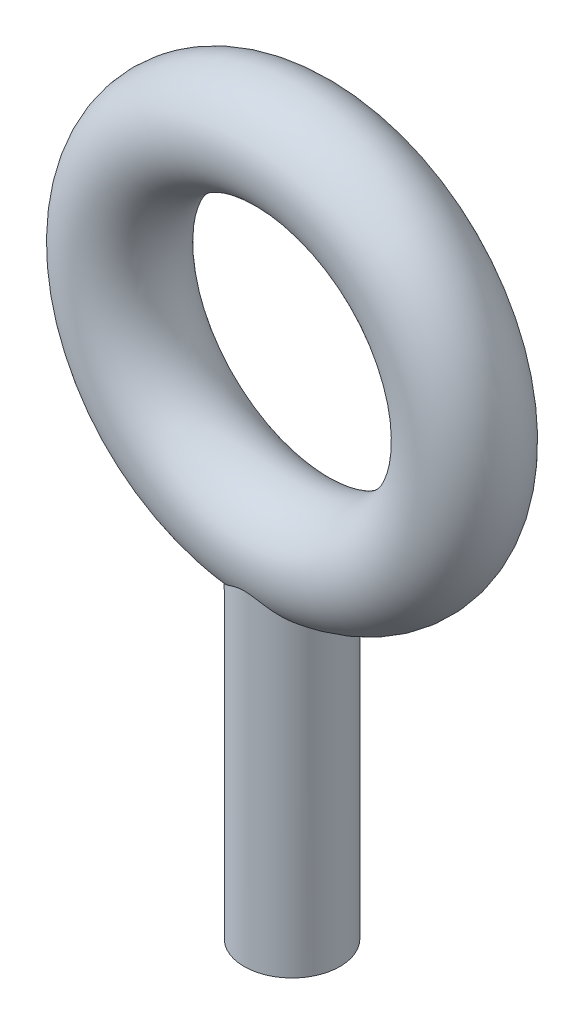
ISO-10303-21;
HEADER;
FILE_DESCRIPTION(('STEP AP214'),'2;1');
FILE_NAME('part.step','',(''),(''),'','','');
FILE_SCHEMA(('AUTOMOTIVE_DESIGN { 1 0 10303 214 1 1 1 1 }'));
ENDSEC;
DATA;
#1=APPLICATION_CONTEXT('core data for automotive mechanical design processes');
#2=APPLICATION_PROTOCOL_DEFINITION('international standard','automotive_design',2000,#1);
#3=PRODUCT_CONTEXT('',#1,'mechanical');
#4=PRODUCT('Part','Part','',(#3));
#5=PRODUCT_RELATED_PRODUCT_CATEGORY('part','',(#4));
#6=PRODUCT_DEFINITION_FORMATION('','',#4);
#7=PRODUCT_DEFINITION_CONTEXT('part definition',#1,'design');
#8=PRODUCT_DEFINITION('design','',#6,#7);
#9=PRODUCT_DEFINITION_SHAPE('','',#8);
#10=(LENGTH_UNIT() NAMED_UNIT(*) SI_UNIT(.MILLI.,.METRE.));
#11=(NAMED_UNIT(*) PLANE_ANGLE_UNIT() SI_UNIT($,.RADIAN.));
#12=(NAMED_UNIT(*) SI_UNIT($,.STERADIAN.) SOLID_ANGLE_UNIT());
#13=UNCERTAINTY_MEASURE_WITH_UNIT(LENGTH_MEASURE(1.E-05),#10,'distance_accuracy_value','');
#14=(GEOMETRIC_REPRESENTATION_CONTEXT(3) GLOBAL_UNCERTAINTY_ASSIGNED_CONTEXT((#13)) GLOBAL_UNIT_ASSIGNED_CONTEXT((#10,
#11,#12)) REPRESENTATION_CONTEXT('',''));
#15=CARTESIAN_POINT('',(0.,0.,0.));
#16=DIRECTION('',(0.,0.,1.));
#17=DIRECTION('',(1.,0.,0.));
#18=AXIS2_PLACEMENT_3D('',#15,#16,#17);
#19=CARTESIAN_POINT('',(0.,0.,0.));
#20=DIRECTION('',(0.,0.,1.));
#21=DIRECTION('',(1.,0.,0.));
#22=AXIS2_PLACEMENT_3D('',#19,#20,#21);
#23=TOROIDAL_SURFACE('',#22,15.875,4.7625);
#24=CARTESIAN_POINT('',(-3.18334869011785,-19.2659447342969,-3.05664304092332));
#25=CARTESIAN_POINT('',(-3.08520725549984,-19.195456140125,-3.15885374831986));
#26=CARTESIAN_POINT('',(-2.98300369281875,-19.1224371757501,-3.25544272208659));
#27=CARTESIAN_POINT('',(-2.77146320632803,-18.9727391863984,-3.43733046760139));
#28=CARTESIAN_POINT('',(-2.66212390909063,-18.8960589459383,-3.52262545397198));
#29=CARTESIAN_POINT('',(-2.43667603383207,-18.7404029703912,-3.68218832160037));
#30=CARTESIAN_POINT('',(-2.32055120131328,-18.6614219713128,-3.7564280750047));
#31=CARTESIAN_POINT('',(-2.08206036337605,-18.5033531147404,-3.89367739228447));
#32=CARTESIAN_POINT('',(-1.9596978329449,-18.4242653401298,-3.95669312293485));
#33=CARTESIAN_POINT('',(-1.69164280901768,-18.2582303100651,-4.07917393133311));
#34=CARTESIAN_POINT('',(-1.54500313693706,-18.1716241098012,-4.13707159067725));
#35=CARTESIAN_POINT('',(-1.3175015779446,-18.0490422142643,-4.21275642069983));
#36=CARTESIAN_POINT('',(-1.24044386447811,-18.0094175677955,-4.23611712501251));
#37=CARTESIAN_POINT('',(-1.0834785691227,-17.9339222411472,-4.27895696584173));
#38=CARTESIAN_POINT('',(-1.00357199164271,-17.8980502551219,-4.29843745473804));
#39=CARTESIAN_POINT('',(-0.811787080465899,-17.8200067314168,-4.33941180720683));
#40=CARTESIAN_POINT('',(-0.698579587280735,-17.7800812621989,-4.35918904782819));
#41=CARTESIAN_POINT('',(-0.466840539080351,-17.7159914683654,-4.39003370437951));
#42=CARTESIAN_POINT('',(-0.348330864188748,-17.6917677930023,-4.4011339513975));
#43=CARTESIAN_POINT('',(-0.106637602209662,-17.6643936227832,-4.41363242324062));
#44=CARTESIAN_POINT('',(0.0165862474403797,-17.6615149031419,-4.41490553210364));
#45=CARTESIAN_POINT('',(0.261219200099468,-17.6784512971815,-4.40722157315114));
#46=CARTESIAN_POINT('',(0.382624281920378,-17.6983108119746,-4.3982444898063));
#47=CARTESIAN_POINT('',(0.654595187868296,-17.7638911459752,-4.3671729736333));
#48=CARTESIAN_POINT('',(0.803296300592718,-17.815479761221,-4.34200839752675));
#49=CARTESIAN_POINT('',(1.09130536567191,-17.9350366742265,-4.27875654110573));
#50=CARTESIAN_POINT('',(1.23056385592844,-18.0030837966793,-4.2406067011385));
#51=CARTESIAN_POINT('',(1.49660175943668,-18.1448471669807,-4.15401619893279));
#52=CARTESIAN_POINT('',(1.62363706716366,-18.2183146455022,-4.10594095530367));
#53=CARTESIAN_POINT('',(1.87128267319161,-18.3684373239188,-3.99915856679065));
#54=CARTESIAN_POINT('',(1.9918881532934,-18.4450948397626,-3.9404435900039));
#55=CARTESIAN_POINT('',(2.22710855638734,-18.5988193834602,-3.81243774597225));
#56=CARTESIAN_POINT('',(2.34172244454083,-18.675886479539,-3.74314505984529));
#57=CARTESIAN_POINT('',(2.5648721320644,-18.8284938507638,-3.59391374623377));
#58=CARTESIAN_POINT('',(2.67340840037861,-18.9040342434207,-3.51397594173002));
#59=CARTESIAN_POINT('',(2.88767858462888,-19.0547097424052,-3.34032464954087));
#60=CARTESIAN_POINT('',(2.99317625659172,-19.1297352735674,-3.24622288396334));
#61=CARTESIAN_POINT('',(3.19627123989967,-19.2750753875729,-3.04645873335221));
#62=CARTESIAN_POINT('',(3.29386695318647,-19.3453890170084,-2.94079401998756));
#63=CARTESIAN_POINT('',(3.47968650965536,-19.4797353231338,-2.71836456295715));
#64=CARTESIAN_POINT('',(3.56793279470794,-19.5437830105596,-2.60162773563995));
#65=CARTESIAN_POINT('',(3.73384835747882,-19.6644171619128,-2.3573131073301));
#66=CARTESIAN_POINT('',(3.8115234347431,-19.7210077164056,-2.22974131348748));
#67=CARTESIAN_POINT('',(3.93188270899008,-19.8087633070891,-2.00689192183502));
#68=CARTESIAN_POINT('',(3.97782790857204,-19.8422827222768,-1.91428349817974));
#69=CARTESIAN_POINT('',(4.06356828600901,-19.904850660436,-1.72481659598971));
#70=CARTESIAN_POINT('',(4.10336501176713,-19.9339003086818,-1.62795919506184));
#71=CARTESIAN_POINT('',(4.17630843818552,-19.9871486050755,-1.43048972788706));
#72=CARTESIAN_POINT('',(4.20945608308148,-20.0113479420154,-1.32987819717416));
#73=CARTESIAN_POINT('',(4.26863503639991,-20.0545497176336,-1.1255389208866));
#74=CARTESIAN_POINT('',(4.29466957859162,-20.0735545178615,-1.02181261524039));
#75=CARTESIAN_POINT('',(4.33935904053496,-20.1061747586216,-0.81139559020075));
#76=CARTESIAN_POINT('',(4.35797686802889,-20.1197631107729,-0.704692757495797));
#77=CARTESIAN_POINT('',(4.38734053977304,-20.141193125458,-0.489679751122092));
#78=CARTESIAN_POINT('',(4.39808959077411,-20.1490371289782,-0.381370250596767));
#79=CARTESIAN_POINT('',(4.41154681394067,-20.1588572187098,-0.163981623608556));
#80=CARTESIAN_POINT('',(4.41425463620663,-20.1608330495784,-0.0549024638623472));
#81=CARTESIAN_POINT('',(4.41158220106968,-20.1588829743878,0.163098451421812));
#82=CARTESIAN_POINT('',(4.40620237585129,-20.1549573836866,0.272020215059305));
#83=CARTESIAN_POINT('',(4.38813436499462,-20.1417722384674,0.480846069993556));
#84=CARTESIAN_POINT('',(4.37601126742602,-20.1329251056126,0.580825519598241));
#85=CARTESIAN_POINT('',(4.34508060874836,-20.1103506605322,0.779196079107355));
#86=CARTESIAN_POINT('',(4.32627088523613,-20.0966217695835,0.877586664411845));
#87=CARTESIAN_POINT('',(4.26017620356357,-20.0483754180609,1.16932575520107));
#88=CARTESIAN_POINT('',(4.20320856784285,-20.006785758739,1.35943314274797));
#89=CARTESIAN_POINT('',(4.06426081936847,-19.9053542929163,1.7318598891137));
#90=CARTESIAN_POINT('',(3.98157680419194,-19.8449988510271,1.91377023288068));
#91=CARTESIAN_POINT('',(3.79547219836248,-19.709301731214,2.26050947514133));
#92=CARTESIAN_POINT('',(3.6920469752157,-19.6339567054362,2.42533454518731));
#93=CARTESIAN_POINT('',(3.45273365520189,-19.4601667609583,2.75731902622884));
#94=CARTESIAN_POINT('',(3.31434335014764,-19.35997371192,2.9217452369487));
#95=CARTESIAN_POINT('',(3.01953343506178,-19.148350826548,3.22553931193551));
#96=CARTESIAN_POINT('',(2.86309124364045,-19.0369069386348,3.3648752203638));
#97=CARTESIAN_POINT('',(2.6005110456801,-18.8533347141641,3.5678684535981));
#98=CARTESIAN_POINT('',(2.49909234627729,-18.7831848658787,3.63959378763196));
#99=CARTESIAN_POINT('',(2.29110913704344,-18.6418478259866,3.77397971013625));
#100=CARTESIAN_POINT('',(2.18454545397074,-18.570660802321,3.83664174858313));
#101=CARTESIAN_POINT('',(1.96631103606924,-18.4288492654853,3.95293414771094));
#102=CARTESIAN_POINT('',(1.85464211289617,-18.3582245630556,4.00656768111351));
#103=CARTESIAN_POINT('',(1.62579958399107,-18.2197594005601,4.10475945090726));
#104=CARTESIAN_POINT('',(1.50862970964617,-18.1519171100274,4.14932373271852));
#105=CARTESIAN_POINT('',(1.2721798172921,-18.0247303189098,4.22768174104107));
#106=CARTESIAN_POINT('',(1.15313019192175,-17.9651669456088,4.26180729114859));
#107=CARTESIAN_POINT('',(0.90798469873521,-17.8567744278247,4.32066949338137));
#108=CARTESIAN_POINT('',(0.781899824264156,-17.8079290935267,4.3454203478201));
#109=CARTESIAN_POINT('',(0.546416247012914,-17.7359582660871,4.38059193244925));
#110=CARTESIAN_POINT('',(0.43827822788134,-17.7097381666914,4.39282217133518));
#111=CARTESIAN_POINT('',(0.218778742952662,-17.6742505434237,4.40918775761412));
#112=CARTESIAN_POINT('',(0.107427541669792,-17.6649340467131,4.41334649208479));
#113=CARTESIAN_POINT('',(-0.115554023139223,-17.6653706892711,4.41314977345117));
#114=CARTESIAN_POINT('',(-0.227184235648427,-17.6751804428569,4.40876904326401));
#115=CARTESIAN_POINT('',(-0.447173105987848,-17.7116459007311,4.39193234014482));
#116=CARTESIAN_POINT('',(-0.555521126604359,-17.7383512778427,4.37945255333685));
#117=CARTESIAN_POINT('',(-0.748508365263635,-17.7980793306073,4.35020708613236));
#118=CARTESIAN_POINT('',(-0.833959576747192,-17.8291579698717,4.33458503877896));
#119=CARTESIAN_POINT('',(-1.00160977891334,-17.8971297393083,4.29894189956268));
#120=CARTESIAN_POINT('',(-1.08380609595186,-17.9340275304001,4.27891727629336));
#121=CARTESIAN_POINT('',(-1.2454475308931,-18.0118781819336,4.23470004538099));
#122=CARTESIAN_POINT('',(-1.32488170102032,-18.0528451377066,4.2104927187647));
#123=CARTESIAN_POINT('',(-1.48104428672478,-18.1373600749905,4.15813211465912));
#124=CARTESIAN_POINT('',(-1.55777175173756,-18.1809089491288,4.12997746784681));
#125=CARTESIAN_POINT('',(-1.76577455729278,-18.3030039415443,4.04712028406215));
#126=CARTESIAN_POINT('',(-1.89452516477656,-18.3831631770395,3.98841560237975));
#127=CARTESIAN_POINT('',(-2.14535798688614,-18.5445849185843,3.85928765083014));
#128=CARTESIAN_POINT('',(-2.26743618597976,-18.6258480530349,3.78885742533097));
#129=CARTESIAN_POINT('',(-2.50470815638171,-18.786920556884,3.63635238424679));
#130=CARTESIAN_POINT('',(-2.61991416091492,-18.8667323223503,3.55429919465701));
#131=CARTESIAN_POINT('',(-2.84322283219172,-19.0232427702371,3.37832198713478));
#132=CARTESIAN_POINT('',(-2.95132489319937,-19.0999411869774,3.2843969589106));
#133=CARTESIAN_POINT('',(-3.13757042846034,-19.2329892006173,3.10570312675419));
#134=CARTESIAN_POINT('',(-3.217230259598,-19.2902237777111,3.02316857643466));
#135=CARTESIAN_POINT('',(-3.37094117672563,-19.4010504369558,2.85076531642693));
#136=CARTESIAN_POINT('',(-3.44499339582738,-19.4546432547592,2.76089809609296));
#137=CARTESIAN_POINT('',(-3.5867363351123,-19.5574431290917,2.57406950022246));
#138=CARTESIAN_POINT('',(-3.65443287812821,-19.6066541978392,2.47711476578007));
#139=CARTESIAN_POINT('',(-3.78275774270601,-19.7000499280635,2.27633639320686));
#140=CARTESIAN_POINT('',(-3.84338684098238,-19.7442351418705,2.1725135118572));
#141=CARTESIAN_POINT('',(-3.94818844818963,-19.820657292626,1.97462884980803));
#142=CARTESIAN_POINT('',(-3.99346373646127,-19.8536911318808,1.88145762061659));
#143=CARTESIAN_POINT('',(-4.07779968187298,-19.9152382180247,1.69090981333725));
#144=CARTESIAN_POINT('',(-4.11686136592548,-19.9437522118988,1.5935339335345));
#145=CARTESIAN_POINT('',(-4.18827898087297,-19.9958875258478,1.39506876246882));
#146=CARTESIAN_POINT('',(-4.22063455150653,-20.0195085830677,1.293979272049));
#147=CARTESIAN_POINT('',(-4.27816828649788,-20.0615089577444,1.0887612875895));
#148=CARTESIAN_POINT('',(-4.30334984120582,-20.0798907512138,0.984634254788853));
#149=CARTESIAN_POINT('',(-4.34627429415349,-20.1112220624094,0.773519555169653));
#150=CARTESIAN_POINT('',(-4.36398108902429,-20.1241452148707,0.666520600645155));
#151=CARTESIAN_POINT('',(-4.39148636115585,-20.1442185907088,0.451017757294883));
#152=CARTESIAN_POINT('',(-4.40128816309062,-20.1513712410381,0.342514520689898));
#153=CARTESIAN_POINT('',(-4.41282948155849,-20.1597931676347,0.124852996693252));
#154=CARTESIAN_POINT('',(-4.41456913128635,-20.1610625410996,0.0156947201533335));
#155=CARTESIAN_POINT('',(-4.40995696019547,-20.1576970284829,-0.202353528403327));
#156=CARTESIAN_POINT('',(-4.40360559132329,-20.1530624721819,-0.31124351506576));
#157=CARTESIAN_POINT('',(-4.38369235361822,-20.138530569955,-0.519758014561395));
#158=CARTESIAN_POINT('',(-4.37070457761803,-20.1290522355627,-0.619467018953816));
#159=CARTESIAN_POINT('',(-4.33808680475969,-20.1052460213493,-0.81721489435071));
#160=CARTESIAN_POINT('',(-4.31845464415663,-20.090916561758,-0.915253210357483));
#161=CARTESIAN_POINT('',(-4.24996036803342,-20.0409176568993,-1.20586818696307));
#162=CARTESIAN_POINT('',(-4.1914857326625,-19.9982269449578,-1.39509410258692));
#163=CARTESIAN_POINT('',(-4.04944246836149,-19.8945386321391,-1.76627531802057));
#164=CARTESIAN_POINT('',(-3.96508055883096,-19.8329623443826,-1.94775731413332));
#165=CARTESIAN_POINT('',(-3.77576184196924,-19.6949406008886,-2.2932875128451));
#166=CARTESIAN_POINT('',(-3.6708176872325,-19.6185042803614,-2.45734633102229));
#167=CARTESIAN_POINT('',(-3.49926144451984,-19.4939795798966,-2.69102641095713));
#168=CARTESIAN_POINT('',(-3.43888644504177,-19.4502251232019,-2.76771343611799));
#169=CARTESIAN_POINT('',(-3.31407433495817,-19.3600130908571,-2.91600215930249));
#170=CARTESIAN_POINT('',(-3.24963814543001,-19.3135561283178,-2.9876050026395));
#171=CARTESIAN_POINT('',(-3.18334869011785,-19.2659447342969,-3.05664304092332));
#172=B_SPLINE_CURVE_WITH_KNOTS('',3,(#24,#25,#26,#27,#28,#29,#30,#31,#32,#33,#34,#35,#36,#37,
#38,#39,#40,#41,#42,#43,#44,#45,#46,#47,#48,#49,#50,#51,#52,#53,#54,#55,#56,#57,#58,#59,#60,#61,
#62,#63,#64,#65,#66,#67,#68,#69,#70,#71,#72,#73,#74,#75,#76,#77,#78,#79,#80,#81,#82,#83,#84,#85,
#86,#87,#88,#89,#90,#91,#92,#93,#94,#95,#96,#97,#98,#99,#100,#101,#102,#103,#104,#105,#106,#107,
#108,#109,#110,#111,#112,#113,#114,#115,#116,#117,#118,#119,#120,#121,#122,#123,#124,#125,#126,
#127,#128,#129,#130,#131,#132,#133,#134,#135,#136,#137,#138,#139,#140,#141,#142,#143,#144,#145,
#146,#147,#148,#149,#150,#151,#152,#153,#154,#155,#156,#157,#158,#159,#160,#161,#162,#163,#164,
#165,#166,#167,#168,#169,#170,#171),.UNSPECIFIED.,.T.,.F.,(4,2,2,2,2,2,2,2,2,2,2,2,2,2,2,2,2,2,
2,2,2,2,2,2,2,2,2,2,2,2,2,2,2,2,2,2,2,2,2,2,2,2,2,2,2,2,2,2,2,2,2,2,2,2,2,2,2,2,2,2,2,2,2,2,2,2,
2,2,2,2,2,2,2,4),(0.,0.474670789495016,0.949500272659104,1.42551794872302,1.90127327586347,
2.43984588867441,2.70891157991838,2.97788332839548,3.34179981228608,3.70433259137777,
4.07147352812582,4.43933260807468,4.9148542785667,5.39270010093673,5.8553657650724,
6.31837339094797,6.78146072282194,7.24451227388544,7.72400116933452,8.20358679360844,
8.68199384105903,9.16013735896593,9.48585843779609,9.8114973809357,10.137090047313,
10.4625344450357,10.7895866056821,11.1165054089325,11.4434384372549,11.7703539956802,
12.0732872629004,12.3763185856539,12.9818101367047,13.6056010732339,14.2295314872927,
14.9383467658676,15.6480585263582,16.0756945848008,16.5032621527377,16.9306791533726,
17.3578103045734,17.7694607149944,18.1804849720195,18.5150277238744,18.8485996868327,
19.1831605326948,19.5187095813369,19.795096035181,20.0717049990206,20.3493079505868,
20.6270074418293,21.1142422730872,21.601767170311,22.0883965985035,22.5750674667054,
22.959297362987,23.3434494108618,23.7272460065598,24.1110003830396,24.436857423971,
24.762660554953,25.0884811839832,25.4141475778639,25.7413694371369,26.0684536018934,
26.3955323628759,26.7225928547569,27.0252208345808,27.3279474602325,27.93295517416,
28.5587534419539,29.1841682096499,29.5048562118649,29.8254717419995),.UNSPECIFIED.);
#173=CARTESIAN_POINT('',(-3.18334869011785,-19.2659447342969,-3.05664304092332));
#174=VERTEX_POINT('',#173);
#175=EDGE_CURVE('E10',#174,#174,#172,.T.);
#176=ORIENTED_EDGE('',*,*,#175,.F.);
#177=EDGE_LOOP('',(#176));
#178=FACE_BOUND('',#177,.T.);
#179=ADVANCED_FACE('F41',(#178),#23,.T.);
#180=CARTESIAN_POINT('',(0.,-47.625,0.));
#181=DIRECTION('',(0.,1.,0.));
#182=DIRECTION('',(0.,0.,1.));
#183=AXIS2_PLACEMENT_3D('',#180,#181,#182);
#184=CYLINDRICAL_SURFACE('',#183,4.41325);
#185=ORIENTED_EDGE('',*,*,#175,.T.);
#186=EDGE_LOOP('',(#185));
#187=FACE_BOUND('',#186,.T.);
#188=CARTESIAN_POINT('',(0.,-47.625,0.));
#189=DIRECTION('',(0.,1.,0.));
#190=DIRECTION('',(0.,0.,1.));
#191=AXIS2_PLACEMENT_3D('',#188,#189,#190);
#192=CIRCLE('',#191,4.41325);
#193=CARTESIAN_POINT('',(0.,-47.625,4.41325));
#194=VERTEX_POINT('',#193);
#195=EDGE_CURVE('E52',#194,#194,#192,.T.);
#196=ORIENTED_EDGE('',*,*,#195,.T.);
#197=EDGE_LOOP('',(#196));
#198=FACE_BOUND('',#197,.T.);
#199=ADVANCED_FACE('F59',(#187,#198),#184,.T.);
#200=CARTESIAN_POINT('',(0.,-47.625,0.));
#201=DIRECTION('',(0.,1.,0.));
#202=DIRECTION('',(0.,0.,1.));
#203=AXIS2_PLACEMENT_3D('',#200,#201,#202);
#204=PLANE('',#203);
#205=ORIENTED_EDGE('',*,*,#195,.F.);
#206=EDGE_LOOP('',(#205));
#207=FACE_BOUND('',#206,.T.);
#208=ADVANCED_FACE('F61',(#207),#204,.F.);
#209=CLOSED_SHELL('',(#179,#199,#208));
#210=MANIFOLD_SOLID_BREP('B2',#209);
#211=ADVANCED_BREP_SHAPE_REPRESENTATION('',(#18,#210),#14);
#212=SHAPE_DEFINITION_REPRESENTATION(#9,#211);
ENDSEC;
END-ISO-10303-21;
